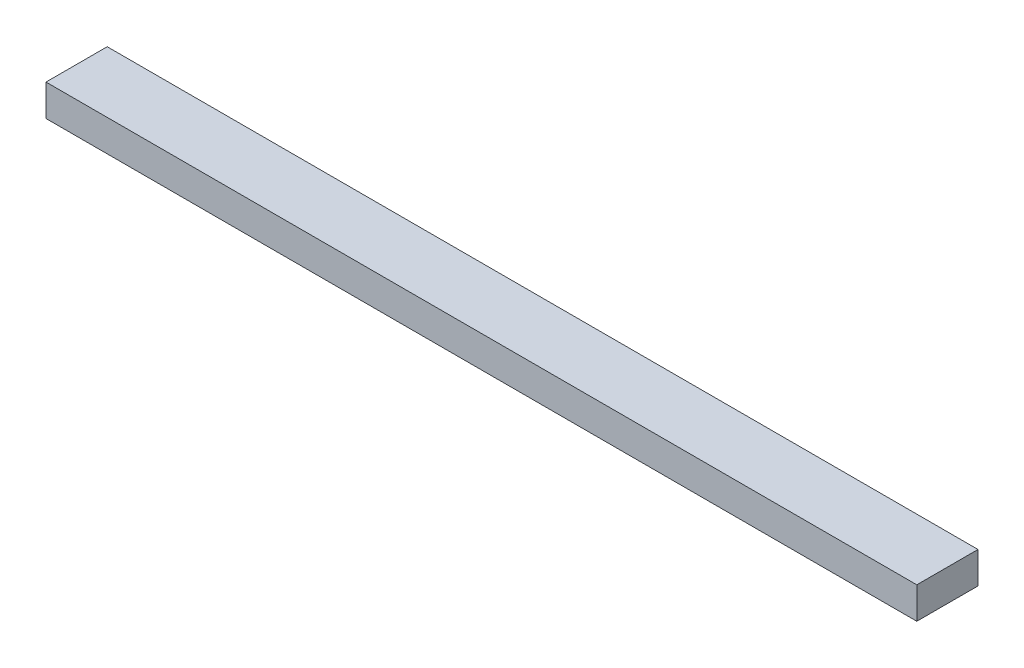
ISO-10303-21;
HEADER;
FILE_DESCRIPTION(('STEP AP214'),'2;1');
FILE_NAME('part.step','',(''),(''),'','','');
FILE_SCHEMA(('AUTOMOTIVE_DESIGN { 1 0 10303 214 1 1 1 1 }'));
ENDSEC;
DATA;
#1=APPLICATION_CONTEXT('core data for automotive mechanical design processes');
#2=APPLICATION_PROTOCOL_DEFINITION('international standard','automotive_design',2000,#1);
#3=PRODUCT_CONTEXT('',#1,'mechanical');
#4=PRODUCT('Part','Part','',(#3));
#5=PRODUCT_RELATED_PRODUCT_CATEGORY('part','',(#4));
#6=PRODUCT_DEFINITION_FORMATION('','',#4);
#7=PRODUCT_DEFINITION_CONTEXT('part definition',#1,'design');
#8=PRODUCT_DEFINITION('design','',#6,#7);
#9=PRODUCT_DEFINITION_SHAPE('','',#8);
#10=(LENGTH_UNIT() NAMED_UNIT(*) SI_UNIT(.MILLI.,.METRE.));
#11=(NAMED_UNIT(*) PLANE_ANGLE_UNIT() SI_UNIT($,.RADIAN.));
#12=(NAMED_UNIT(*) SI_UNIT($,.STERADIAN.) SOLID_ANGLE_UNIT());
#13=UNCERTAINTY_MEASURE_WITH_UNIT(LENGTH_MEASURE(1.E-05),#10,'distance_accuracy_value','');
#14=(GEOMETRIC_REPRESENTATION_CONTEXT(3) GLOBAL_UNCERTAINTY_ASSIGNED_CONTEXT((#13)) GLOBAL_UNIT_ASSIGNED_CONTEXT((#10,
#11,#12)) REPRESENTATION_CONTEXT('',''));
#15=CARTESIAN_POINT('',(0.,0.,0.));
#16=DIRECTION('',(0.,0.,1.));
#17=DIRECTION('',(1.,0.,0.));
#18=AXIS2_PLACEMENT_3D('',#15,#16,#17);
#19=CARTESIAN_POINT('',(-87.5,6.35,-6.15));
#20=DIRECTION('',(1.,0.,0.));
#21=DIRECTION('',(0.,0.,-1.));
#22=AXIS2_PLACEMENT_3D('',#19,#20,#21);
#23=PLANE('',#22);
#24=DIRECTION('',(0.,0.,1.));
#25=VECTOR('',#24,1.);
#26=CARTESIAN_POINT('',(-87.5,0.,-6.15));
#27=LINE('',#26,#25);
#28=CARTESIAN_POINT('',(-87.5,0.,-6.15));
#29=VERTEX_POINT('',#28);
#30=CARTESIAN_POINT('',(-87.5,0.,6.15));
#31=VERTEX_POINT('',#30);
#32=EDGE_CURVE('E107',#29,#31,#27,.T.);
#33=ORIENTED_EDGE('',*,*,#32,.T.);
#34=DIRECTION('',(0.,-1.,0.));
#35=VECTOR('',#34,1.);
#36=CARTESIAN_POINT('',(-87.5,6.35,6.15));
#37=LINE('',#36,#35);
#38=CARTESIAN_POINT('',(-87.5,6.35,6.15));
#39=VERTEX_POINT('',#38);
#40=EDGE_CURVE('E11',#39,#31,#37,.T.);
#41=ORIENTED_EDGE('',*,*,#40,.F.);
#42=DIRECTION('',(0.,0.,1.));
#43=VECTOR('',#42,1.);
#44=CARTESIAN_POINT('',(-87.5,6.35,-6.15));
#45=LINE('',#44,#43);
#46=CARTESIAN_POINT('',(-87.5,6.35,-6.15));
#47=VERTEX_POINT('',#46);
#48=EDGE_CURVE('E91',#47,#39,#45,.T.);
#49=ORIENTED_EDGE('',*,*,#48,.F.);
#50=DIRECTION('',(0.,-1.,0.));
#51=VECTOR('',#50,1.);
#52=CARTESIAN_POINT('',(-87.5,6.35,-6.15));
#53=LINE('',#52,#51);
#54=EDGE_CURVE('E103',#47,#29,#53,.T.);
#55=ORIENTED_EDGE('',*,*,#54,.T.);
#56=EDGE_LOOP('',(#33,#41,#49,#55));
#57=FACE_BOUND('',#56,.T.);
#58=ADVANCED_FACE('F39',(#57),#23,.F.);
#59=CARTESIAN_POINT('',(-87.5,6.35,6.15));
#60=DIRECTION('',(0.,0.,-1.));
#61=DIRECTION('',(-1.,0.,0.));
#62=AXIS2_PLACEMENT_3D('',#59,#60,#61);
#63=PLANE('',#62);
#64=DIRECTION('',(1.,0.,0.));
#65=VECTOR('',#64,1.);
#66=CARTESIAN_POINT('',(-87.5,0.,6.15));
#67=LINE('',#66,#65);
#68=CARTESIAN_POINT('',(87.5,0.,6.15));
#69=VERTEX_POINT('',#68);
#70=EDGE_CURVE('E96',#31,#69,#67,.T.);
#71=ORIENTED_EDGE('',*,*,#70,.T.);
#72=DIRECTION('',(0.,-1.,0.));
#73=VECTOR('',#72,1.);
#74=CARTESIAN_POINT('',(87.5,6.35,6.15));
#75=LINE('',#74,#73);
#76=CARTESIAN_POINT('',(87.5,6.35,6.15));
#77=VERTEX_POINT('',#76);
#78=EDGE_CURVE('E48',#77,#69,#75,.T.);
#79=ORIENTED_EDGE('',*,*,#78,.F.);
#80=DIRECTION('',(1.,0.,0.));
#81=VECTOR('',#80,1.);
#82=CARTESIAN_POINT('',(-87.5,6.35,6.15));
#83=LINE('',#82,#81);
#84=EDGE_CURVE('E86',#39,#77,#83,.T.);
#85=ORIENTED_EDGE('',*,*,#84,.F.);
#86=ORIENTED_EDGE('',*,*,#40,.T.);
#87=EDGE_LOOP('',(#71,#79,#85,#86));
#88=FACE_BOUND('',#87,.T.);
#89=ADVANCED_FACE('F95',(#88),#63,.F.);
#90=CARTESIAN_POINT('',(87.5,6.35,-6.15));
#91=DIRECTION('',(-1.,0.,0.));
#92=DIRECTION('',(0.,0.,1.));
#93=AXIS2_PLACEMENT_3D('',#90,#91,#92);
#94=PLANE('',#93);
#95=DIRECTION('',(0.,0.,-1.));
#96=VECTOR('',#95,1.);
#97=CARTESIAN_POINT('',(87.5,0.,-6.15));
#98=LINE('',#97,#96);
#99=CARTESIAN_POINT('',(87.5,0.,-6.15));
#100=VERTEX_POINT('',#99);
#101=EDGE_CURVE('E73',#69,#100,#98,.T.);
#102=ORIENTED_EDGE('',*,*,#101,.T.);
#103=DIRECTION('',(0.,-1.,0.));
#104=VECTOR('',#103,1.);
#105=CARTESIAN_POINT('',(87.5,6.35,-6.15));
#106=LINE('',#105,#104);
#107=CARTESIAN_POINT('',(87.5,6.35,-6.15));
#108=VERTEX_POINT('',#107);
#109=EDGE_CURVE('E98',#108,#100,#106,.T.);
#110=ORIENTED_EDGE('',*,*,#109,.F.);
#111=DIRECTION('',(0.,0.,-1.));
#112=VECTOR('',#111,1.);
#113=CARTESIAN_POINT('',(87.5,6.35,-6.15));
#114=LINE('',#113,#112);
#115=EDGE_CURVE('E89',#77,#108,#114,.T.);
#116=ORIENTED_EDGE('',*,*,#115,.F.);
#117=ORIENTED_EDGE('',*,*,#78,.T.);
#118=EDGE_LOOP('',(#102,#110,#116,#117));
#119=FACE_BOUND('',#118,.T.);
#120=ADVANCED_FACE('F99',(#119),#94,.F.);
#121=CARTESIAN_POINT('',(-87.5,6.35,-6.15));
#122=DIRECTION('',(0.,0.,1.));
#123=DIRECTION('',(1.,0.,0.));
#124=AXIS2_PLACEMENT_3D('',#121,#122,#123);
#125=PLANE('',#124);
#126=DIRECTION('',(-1.,0.,0.));
#127=VECTOR('',#126,1.);
#128=CARTESIAN_POINT('',(-87.5,0.,-6.15));
#129=LINE('',#128,#127);
#130=EDGE_CURVE('E79',#100,#29,#129,.T.);
#131=ORIENTED_EDGE('',*,*,#130,.T.);
#132=ORIENTED_EDGE('',*,*,#54,.F.);
#133=DIRECTION('',(-1.,0.,0.));
#134=VECTOR('',#133,1.);
#135=CARTESIAN_POINT('',(-87.5,6.35,-6.15));
#136=LINE('',#135,#134);
#137=EDGE_CURVE('E56',#108,#47,#136,.T.);
#138=ORIENTED_EDGE('',*,*,#137,.F.);
#139=ORIENTED_EDGE('',*,*,#109,.T.);
#140=EDGE_LOOP('',(#131,#132,#138,#139));
#141=FACE_BOUND('',#140,.T.);
#142=ADVANCED_FACE('F120',(#141),#125,.F.);
#143=CARTESIAN_POINT('',(0.,6.35,0.));
#144=DIRECTION('',(0.,1.,0.));
#145=DIRECTION('',(0.,0.,1.));
#146=AXIS2_PLACEMENT_3D('',#143,#144,#145);
#147=PLANE('',#146);
#148=ORIENTED_EDGE('',*,*,#48,.T.);
#149=ORIENTED_EDGE('',*,*,#84,.T.);
#150=ORIENTED_EDGE('',*,*,#115,.T.);
#151=ORIENTED_EDGE('',*,*,#137,.T.);
#152=EDGE_LOOP('',(#148,#149,#150,#151));
#153=FACE_BOUND('',#152,.T.);
#154=ADVANCED_FACE('F87',(#153),#147,.T.);
#155=CARTESIAN_POINT('',(0.,0.,0.));
#156=DIRECTION('',(0.,1.,0.));
#157=DIRECTION('',(0.,0.,1.));
#158=AXIS2_PLACEMENT_3D('',#155,#156,#157);
#159=PLANE('',#158);
#160=ORIENTED_EDGE('',*,*,#32,.F.);
#161=ORIENTED_EDGE('',*,*,#130,.F.);
#162=ORIENTED_EDGE('',*,*,#101,.F.);
#163=ORIENTED_EDGE('',*,*,#70,.F.);
#164=EDGE_LOOP('',(#160,#161,#162,#163));
#165=FACE_BOUND('',#164,.T.);
#166=ADVANCED_FACE('F123',(#165),#159,.F.);
#167=CLOSED_SHELL('',(#58,#89,#120,#142,#154,#166));
#168=MANIFOLD_SOLID_BREP('B2',#167);
#169=ADVANCED_BREP_SHAPE_REPRESENTATION('',(#18,#168),#14);
#170=SHAPE_DEFINITION_REPRESENTATION(#9,#169);
ENDSEC;
END-ISO-10303-21;
